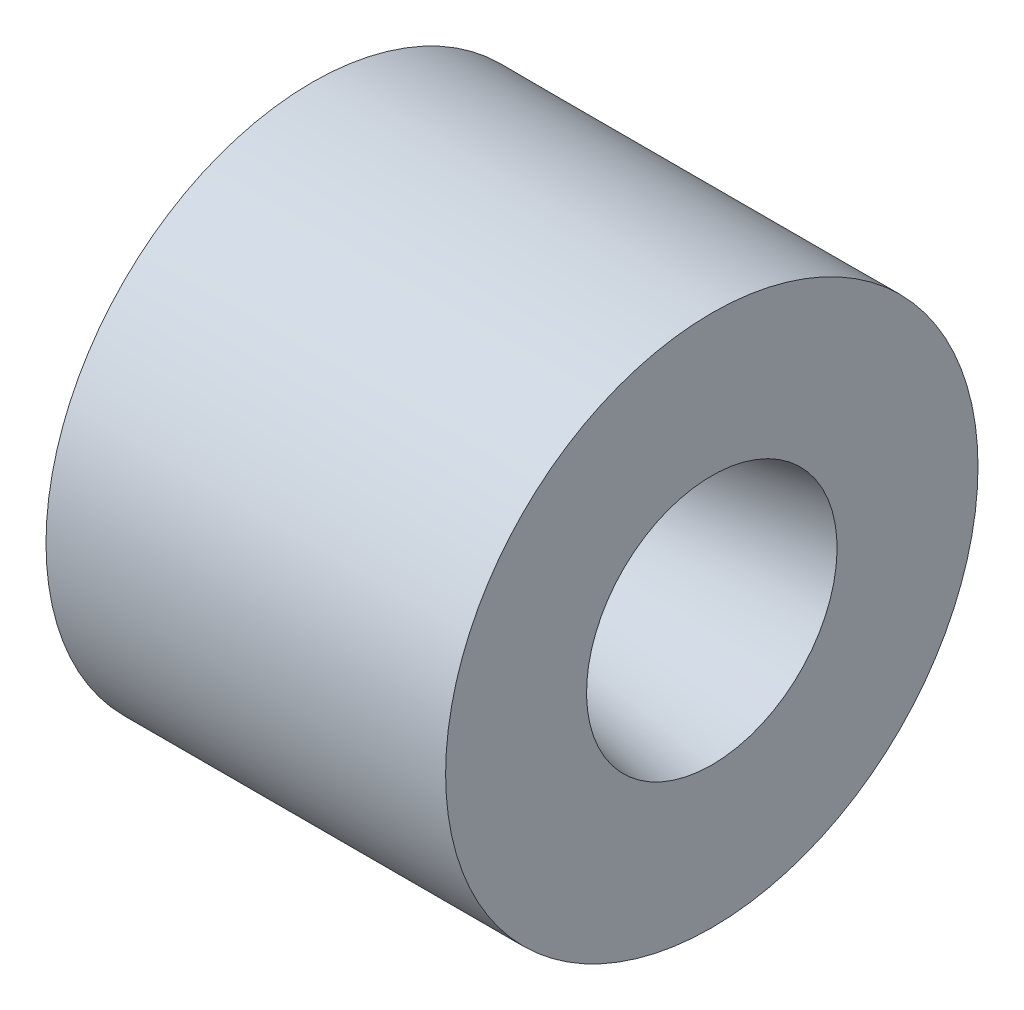
ISO-10303-21;
HEADER;
FILE_DESCRIPTION(('STEP AP214'),'2;1');
FILE_NAME('part.step','',(''),(''),'','','');
FILE_SCHEMA(('AUTOMOTIVE_DESIGN { 1 0 10303 214 1 1 1 1 }'));
ENDSEC;
DATA;
#1=APPLICATION_CONTEXT('core data for automotive mechanical design processes');
#2=APPLICATION_PROTOCOL_DEFINITION('international standard','automotive_design',2000,#1);
#3=PRODUCT_CONTEXT('',#1,'mechanical');
#4=PRODUCT('Part','Part','',(#3));
#5=PRODUCT_RELATED_PRODUCT_CATEGORY('part','',(#4));
#6=PRODUCT_DEFINITION_FORMATION('','',#4);
#7=PRODUCT_DEFINITION_CONTEXT('part definition',#1,'design');
#8=PRODUCT_DEFINITION('design','',#6,#7);
#9=PRODUCT_DEFINITION_SHAPE('','',#8);
#10=(LENGTH_UNIT() NAMED_UNIT(*) SI_UNIT(.MILLI.,.METRE.));
#11=(NAMED_UNIT(*) PLANE_ANGLE_UNIT() SI_UNIT($,.RADIAN.));
#12=(NAMED_UNIT(*) SI_UNIT($,.STERADIAN.) SOLID_ANGLE_UNIT());
#13=UNCERTAINTY_MEASURE_WITH_UNIT(LENGTH_MEASURE(1.E-05),#10,'distance_accuracy_value','');
#14=(GEOMETRIC_REPRESENTATION_CONTEXT(3) GLOBAL_UNCERTAINTY_ASSIGNED_CONTEXT((#13)) GLOBAL_UNIT_ASSIGNED_CONTEXT((#10,
#11,#12)) REPRESENTATION_CONTEXT('',''));
#15=CARTESIAN_POINT('',(0.,0.,0.));
#16=DIRECTION('',(0.,0.,1.));
#17=DIRECTION('',(1.,0.,0.));
#18=AXIS2_PLACEMENT_3D('',#15,#16,#17);
#19=CARTESIAN_POINT('',(25.4773806282848,0.,0.));
#20=DIRECTION('',(1.,0.,0.));
#21=DIRECTION('',(0.,1.,0.));
#22=AXIS2_PLACEMENT_3D('',#19,#20,#21);
#23=CONICAL_SURFACE('',#22,17.,2.16949424222713E-06);
#24=CARTESIAN_POINT('',(-0.0433875599948093,0.,0.));
#25=DIRECTION('',(-1.,0.,0.));
#26=DIRECTION('',(0.,-1.,0.));
#27=AXIS2_PLACEMENT_3D('',#24,#25,#26);
#28=CIRCLE('',#27,16.9999446328404);
#29=CARTESIAN_POINT('',(-0.0433875599948093,-16.9999446328404,0.));
#30=VERTEX_POINT('',#29);
#31=EDGE_CURVE('E10',#30,#30,#28,.T.);
#32=ORIENTED_EDGE('',*,*,#31,.F.);
#33=EDGE_LOOP('',(#32));
#34=FACE_BOUND('',#33,.T.);
#35=CARTESIAN_POINT('',(25.4773806282848,0.,0.));
#36=DIRECTION('',(-1.,0.,0.));
#37=DIRECTION('',(0.,-1.,0.));
#38=AXIS2_PLACEMENT_3D('',#35,#36,#37);
#39=CIRCLE('',#38,17.);
#40=CARTESIAN_POINT('',(25.4773806282848,-17.,0.));
#41=VERTEX_POINT('',#40);
#42=EDGE_CURVE('E45',#41,#41,#39,.T.);
#43=ORIENTED_EDGE('',*,*,#42,.T.);
#44=EDGE_LOOP('',(#43));
#45=FACE_BOUND('',#44,.T.);
#46=ADVANCED_FACE('F31',(#34,#45),#23,.T.);
#47=CARTESIAN_POINT('',(-0.0433875599948095,16.9999446328404,0.));
#48=DIRECTION('',(1.,0.,0.));
#49=DIRECTION('',(0.,1.,0.));
#50=AXIS2_PLACEMENT_3D('',#47,#48,#49);
#51=PLANE('',#50);
#52=CARTESIAN_POINT('',(-0.0433875599948095,0.,0.));
#53=DIRECTION('',(-1.,0.,0.));
#54=DIRECTION('',(0.,-1.,0.));
#55=AXIS2_PLACEMENT_3D('',#52,#53,#54);
#56=CIRCLE('',#55,3.5);
#57=CARTESIAN_POINT('',(-0.0433875599948095,-3.5,0.));
#58=VERTEX_POINT('',#57);
#59=EDGE_CURVE('E37',#58,#58,#56,.T.);
#60=ORIENTED_EDGE('',*,*,#59,.F.);
#61=EDGE_LOOP('',(#60));
#62=FACE_BOUND('',#61,.T.);
#63=ORIENTED_EDGE('',*,*,#31,.T.);
#64=EDGE_LOOP('',(#63));
#65=FACE_BOUND('',#64,.T.);
#66=ADVANCED_FACE('F60',(#62,#65),#51,.F.);
#67=CARTESIAN_POINT('',(-0.0433875599948095,0.,0.));
#68=DIRECTION('',(1.,0.,0.));
#69=DIRECTION('',(0.,1.,0.));
#70=AXIS2_PLACEMENT_3D('',#67,#68,#69);
#71=CONICAL_SURFACE('',#70,3.5,0.174532925199434);
#72=CARTESIAN_POINT('',(25.4773806282848,0.,0.));
#73=DIRECTION('',(-1.,0.,0.));
#74=DIRECTION('',(0.,-1.,0.));
#75=AXIS2_PLACEMENT_3D('',#72,#73,#74);
#76=CIRCLE('',#75,8.);
#77=CARTESIAN_POINT('',(25.4773806282848,-8.,0.));
#78=VERTEX_POINT('',#77);
#79=EDGE_CURVE('E41',#78,#78,#76,.T.);
#80=ORIENTED_EDGE('',*,*,#79,.F.);
#81=EDGE_LOOP('',(#80));
#82=FACE_BOUND('',#81,.T.);
#83=ORIENTED_EDGE('',*,*,#59,.T.);
#84=EDGE_LOOP('',(#83));
#85=FACE_BOUND('',#84,.T.);
#86=ADVANCED_FACE('F55',(#82,#85),#71,.F.);
#87=CARTESIAN_POINT('',(25.4773806282848,8.,0.));
#88=DIRECTION('',(-1.,0.,0.));
#89=DIRECTION('',(0.,-1.,0.));
#90=AXIS2_PLACEMENT_3D('',#87,#88,#89);
#91=PLANE('',#90);
#92=ORIENTED_EDGE('',*,*,#42,.F.);
#93=EDGE_LOOP('',(#92));
#94=FACE_BOUND('',#93,.T.);
#95=ORIENTED_EDGE('',*,*,#79,.T.);
#96=EDGE_LOOP('',(#95));
#97=FACE_BOUND('',#96,.T.);
#98=ADVANCED_FACE('F52',(#94,#97),#91,.F.);
#99=CLOSED_SHELL('',(#46,#66,#86,#98));
#100=MANIFOLD_SOLID_BREP('B2',#99);
#101=ADVANCED_BREP_SHAPE_REPRESENTATION('',(#18,#100),#14);
#102=SHAPE_DEFINITION_REPRESENTATION(#9,#101);
ENDSEC;
END-ISO-10303-21;
